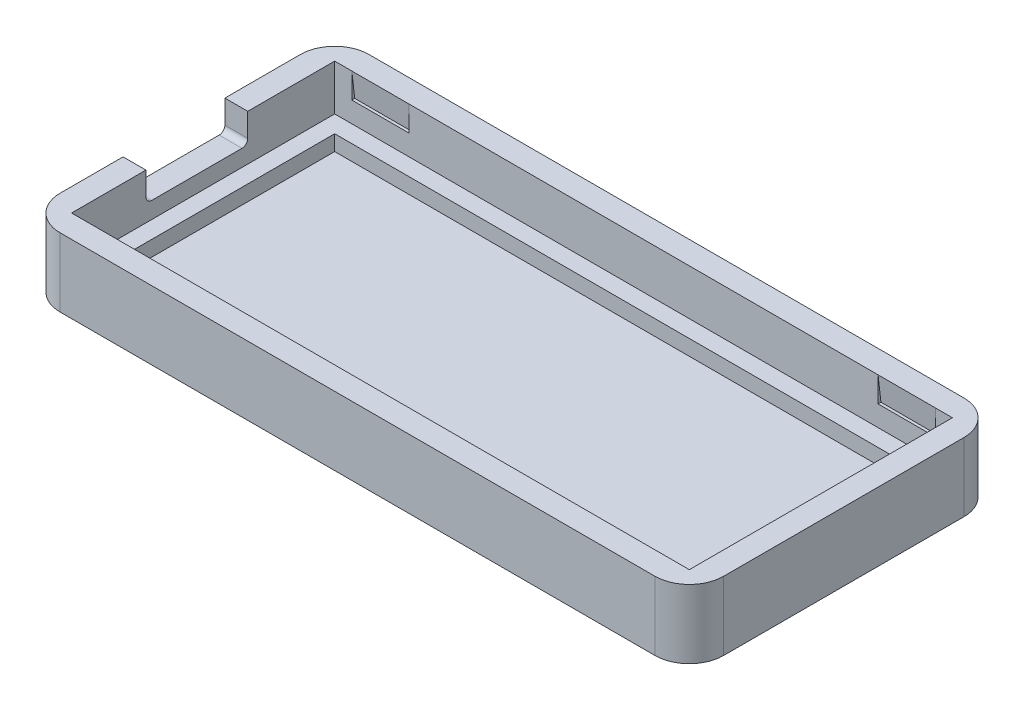
ISO-10303-21;
HEADER;
FILE_DESCRIPTION(('STEP AP214'),'2;1');
FILE_NAME('part.step','',(''),(''),'','','');
FILE_SCHEMA(('AUTOMOTIVE_DESIGN { 1 0 10303 214 1 1 1 1 }'));
ENDSEC;
DATA;
#1=APPLICATION_CONTEXT('core data for automotive mechanical design processes');
#2=APPLICATION_PROTOCOL_DEFINITION('international standard','automotive_design',2000,#1);
#3=PRODUCT_CONTEXT('',#1,'mechanical');
#4=PRODUCT('Part','Part','',(#3));
#5=PRODUCT_RELATED_PRODUCT_CATEGORY('part','',(#4));
#6=PRODUCT_DEFINITION_FORMATION('','',#4);
#7=PRODUCT_DEFINITION_CONTEXT('part definition',#1,'design');
#8=PRODUCT_DEFINITION('design','',#6,#7);
#9=PRODUCT_DEFINITION_SHAPE('','',#8);
#10=(LENGTH_UNIT() NAMED_UNIT(*) SI_UNIT(.MILLI.,.METRE.));
#11=(NAMED_UNIT(*) PLANE_ANGLE_UNIT() SI_UNIT($,.RADIAN.));
#12=(NAMED_UNIT(*) SI_UNIT($,.STERADIAN.) SOLID_ANGLE_UNIT());
#13=UNCERTAINTY_MEASURE_WITH_UNIT(LENGTH_MEASURE(1.E-05),#10,'distance_accuracy_value','');
#14=(GEOMETRIC_REPRESENTATION_CONTEXT(3) GLOBAL_UNCERTAINTY_ASSIGNED_CONTEXT((#13)) GLOBAL_UNIT_ASSIGNED_CONTEXT((#10,
#11,#12)) REPRESENTATION_CONTEXT('',''));
#15=CARTESIAN_POINT('',(0.,0.,0.));
#16=DIRECTION('',(0.,0.,1.));
#17=DIRECTION('',(1.,0.,0.));
#18=AXIS2_PLACEMENT_3D('',#15,#16,#17);
#19=CARTESIAN_POINT('',(-29.,6.,-13.5));
#20=DIRECTION('',(1.,0.,0.));
#21=DIRECTION('',(0.,0.,-1.));
#22=AXIS2_PLACEMENT_3D('',#19,#20,#21);
#23=PLANE('',#22);
#24=DIRECTION('',(0.,0.,1.));
#25=VECTOR('',#24,1.);
#26=CARTESIAN_POINT('',(-29.,0.,-13.5));
#27=LINE('',#26,#25);
#28=CARTESIAN_POINT('',(-29.,0.,-10.5));
#29=VERTEX_POINT('',#28);
#30=CARTESIAN_POINT('',(-29.,0.,10.5));
#31=VERTEX_POINT('',#30);
#32=EDGE_CURVE('E313',#29,#31,#27,.T.);
#33=ORIENTED_EDGE('',*,*,#32,.T.);
#34=DIRECTION('',(0.,-1.,0.));
#35=VECTOR('',#34,1.);
#36=CARTESIAN_POINT('',(-29.,6.,10.5));
#37=LINE('',#36,#35);
#38=CARTESIAN_POINT('',(-29.,6.,10.5));
#39=VERTEX_POINT('',#38);
#40=EDGE_CURVE('E12',#31,#39,#37,.F.);
#41=ORIENTED_EDGE('',*,*,#40,.T.);
#42=DIRECTION('',(0.,0.,1.));
#43=VECTOR('',#42,1.);
#44=CARTESIAN_POINT('',(-29.,6.,-13.5));
#45=LINE('',#44,#43);
#46=CARTESIAN_POINT('',(-29.,6.,5.));
#47=VERTEX_POINT('',#46);
#48=EDGE_CURVE('E318',#47,#39,#45,.T.);
#49=ORIENTED_EDGE('',*,*,#48,.F.);
#50=DIRECTION('',(0.,-1.,0.));
#51=VECTOR('',#50,1.);
#52=CARTESIAN_POINT('',(-29.,6.,5.));
#53=LINE('',#52,#51);
#54=CARTESIAN_POINT('',(-29.,3.95,5.));
#55=VERTEX_POINT('',#54);
#56=EDGE_CURVE('E814',#47,#55,#53,.T.);
#57=ORIENTED_EDGE('',*,*,#56,.T.);
#58=CARTESIAN_POINT('',(-29.,3.95,4.5));
#59=DIRECTION('',(1.,0.,0.));
#60=DIRECTION('',(0.,0.,-1.));
#61=AXIS2_PLACEMENT_3D('',#58,#59,#60);
#62=CIRCLE('',#61,0.5);
#63=CARTESIAN_POINT('',(-29.,3.45,4.5));
#64=VERTEX_POINT('',#63);
#65=EDGE_CURVE('E349',#55,#64,#62,.T.);
#66=ORIENTED_EDGE('',*,*,#65,.T.);
#67=DIRECTION('',(0.,0.,-1.));
#68=VECTOR('',#67,1.);
#69=CARTESIAN_POINT('',(-29.,3.45,5.));
#70=LINE('',#69,#68);
#71=CARTESIAN_POINT('',(-29.,3.45,-3.4));
#72=VERTEX_POINT('',#71);
#73=EDGE_CURVE('E950',#64,#72,#70,.T.);
#74=ORIENTED_EDGE('',*,*,#73,.T.);
#75=CARTESIAN_POINT('',(-29.,3.95,-3.4));
#76=DIRECTION('',(1.,0.,0.));
#77=DIRECTION('',(0.,0.,-1.));
#78=AXIS2_PLACEMENT_3D('',#75,#76,#77);
#79=CIRCLE('',#78,0.5);
#80=CARTESIAN_POINT('',(-29.,3.95,-3.9));
#81=VERTEX_POINT('',#80);
#82=EDGE_CURVE('E353',#72,#81,#79,.T.);
#83=ORIENTED_EDGE('',*,*,#82,.T.);
#84=DIRECTION('',(0.,1.,0.));
#85=VECTOR('',#84,1.);
#86=CARTESIAN_POINT('',(-29.,6.,-3.9));
#87=LINE('',#86,#85);
#88=CARTESIAN_POINT('',(-29.,6.,-3.9));
#89=VERTEX_POINT('',#88);
#90=EDGE_CURVE('E826',#81,#89,#87,.T.);
#91=ORIENTED_EDGE('',*,*,#90,.T.);
#92=CARTESIAN_POINT('',(-29.,6.,-10.5));
#93=VERTEX_POINT('',#92);
#94=EDGE_CURVE('E315',#93,#89,#45,.T.);
#95=ORIENTED_EDGE('',*,*,#94,.F.);
#96=DIRECTION('',(0.,-1.,0.));
#97=VECTOR('',#96,1.);
#98=CARTESIAN_POINT('',(-29.,6.,-10.5));
#99=LINE('',#98,#97);
#100=EDGE_CURVE('E43',#93,#29,#99,.T.);
#101=ORIENTED_EDGE('',*,*,#100,.T.);
#102=EDGE_LOOP('',(#33,#41,#49,#57,#66,#74,#83,#91,#95,#101));
#103=FACE_BOUND('',#102,.T.);
#104=ADVANCED_FACE('F35',(#103),#23,.F.);
#105=CARTESIAN_POINT('',(-29.,6.,13.5));
#106=DIRECTION('',(0.,0.,-1.));
#107=DIRECTION('',(-1.,0.,0.));
#108=AXIS2_PLACEMENT_3D('',#105,#106,#107);
#109=PLANE('',#108);
#110=DIRECTION('',(1.,0.,0.));
#111=VECTOR('',#110,1.);
#112=CARTESIAN_POINT('',(-29.,0.,13.5));
#113=LINE('',#112,#111);
#114=CARTESIAN_POINT('',(-26.,0.,13.5));
#115=VERTEX_POINT('',#114);
#116=CARTESIAN_POINT('',(26.,0.,13.5));
#117=VERTEX_POINT('',#116);
#118=EDGE_CURVE('E329',#115,#117,#113,.T.);
#119=ORIENTED_EDGE('',*,*,#118,.T.);
#120=DIRECTION('',(0.,-1.,0.));
#121=VECTOR('',#120,1.);
#122=CARTESIAN_POINT('',(26.,6.,13.5));
#123=LINE('',#122,#121);
#124=CARTESIAN_POINT('',(26.,6.,13.5));
#125=VERTEX_POINT('',#124);
#126=EDGE_CURVE('E384',#117,#125,#123,.F.);
#127=ORIENTED_EDGE('',*,*,#126,.T.);
#128=DIRECTION('',(1.,0.,0.));
#129=VECTOR('',#128,1.);
#130=CARTESIAN_POINT('',(-29.,6.,13.5));
#131=LINE('',#130,#129);
#132=CARTESIAN_POINT('',(-26.,6.,13.5));
#133=VERTEX_POINT('',#132);
#134=EDGE_CURVE('E317',#133,#125,#131,.T.);
#135=ORIENTED_EDGE('',*,*,#134,.F.);
#136=DIRECTION('',(0.,-1.,0.));
#137=VECTOR('',#136,1.);
#138=CARTESIAN_POINT('',(-26.,6.,13.5));
#139=LINE('',#138,#137);
#140=EDGE_CURVE('E381',#133,#115,#139,.T.);
#141=ORIENTED_EDGE('',*,*,#140,.T.);
#142=EDGE_LOOP('',(#119,#127,#135,#141));
#143=FACE_BOUND('',#142,.T.);
#144=ADVANCED_FACE('F404',(#143),#109,.F.);
#145=CARTESIAN_POINT('',(29.,6.,-13.5));
#146=DIRECTION('',(-1.,0.,0.));
#147=DIRECTION('',(0.,0.,1.));
#148=AXIS2_PLACEMENT_3D('',#145,#146,#147);
#149=PLANE('',#148);
#150=DIRECTION('',(0.,0.,-1.));
#151=VECTOR('',#150,1.);
#152=CARTESIAN_POINT('',(29.,0.,-13.5));
#153=LINE('',#152,#151);
#154=CARTESIAN_POINT('',(29.,0.,10.5));
#155=VERTEX_POINT('',#154);
#156=CARTESIAN_POINT('',(29.,0.,-10.5));
#157=VERTEX_POINT('',#156);
#158=EDGE_CURVE('E332',#155,#157,#153,.T.);
#159=ORIENTED_EDGE('',*,*,#158,.T.);
#160=DIRECTION('',(0.,-1.,0.));
#161=VECTOR('',#160,1.);
#162=CARTESIAN_POINT('',(29.,6.,-10.5));
#163=LINE('',#162,#161);
#164=CARTESIAN_POINT('',(29.,6.,-10.5));
#165=VERTEX_POINT('',#164);
#166=EDGE_CURVE('E371',#157,#165,#163,.F.);
#167=ORIENTED_EDGE('',*,*,#166,.T.);
#168=DIRECTION('',(0.,0.,-1.));
#169=VECTOR('',#168,1.);
#170=CARTESIAN_POINT('',(29.,6.,-13.5));
#171=LINE('',#170,#169);
#172=CARTESIAN_POINT('',(29.,6.,10.5));
#173=VERTEX_POINT('',#172);
#174=EDGE_CURVE('E321',#173,#165,#171,.T.);
#175=ORIENTED_EDGE('',*,*,#174,.F.);
#176=DIRECTION('',(0.,-1.,0.));
#177=VECTOR('',#176,1.);
#178=CARTESIAN_POINT('',(29.,6.,10.5));
#179=LINE('',#178,#177);
#180=EDGE_CURVE('E368',#173,#155,#179,.T.);
#181=ORIENTED_EDGE('',*,*,#180,.T.);
#182=EDGE_LOOP('',(#159,#167,#175,#181));
#183=FACE_BOUND('',#182,.T.);
#184=ADVANCED_FACE('F414',(#183),#149,.F.);
#185=CARTESIAN_POINT('',(-29.,6.,-13.5));
#186=DIRECTION('',(0.,0.,1.));
#187=DIRECTION('',(1.,0.,0.));
#188=AXIS2_PLACEMENT_3D('',#185,#186,#187);
#189=PLANE('',#188);
#190=DIRECTION('',(-1.,0.,0.));
#191=VECTOR('',#190,1.);
#192=CARTESIAN_POINT('',(-29.,6.,-13.5));
#193=LINE('',#192,#191);
#194=CARTESIAN_POINT('',(26.,6.,-13.5));
#195=VERTEX_POINT('',#194);
#196=CARTESIAN_POINT('',(-26.,6.,-13.5));
#197=VERTEX_POINT('',#196);
#198=EDGE_CURVE('E323',#195,#197,#193,.T.);
#199=ORIENTED_EDGE('',*,*,#198,.F.);
#200=DIRECTION('',(0.,-1.,0.));
#201=VECTOR('',#200,1.);
#202=CARTESIAN_POINT('',(26.,6.,-13.5));
#203=LINE('',#202,#201);
#204=CARTESIAN_POINT('',(26.,0.,-13.5));
#205=VERTEX_POINT('',#204);
#206=EDGE_CURVE('E357',#195,#205,#203,.T.);
#207=ORIENTED_EDGE('',*,*,#206,.T.);
#208=DIRECTION('',(-1.,0.,0.));
#209=VECTOR('',#208,1.);
#210=CARTESIAN_POINT('',(-29.,0.,-13.5));
#211=LINE('',#210,#209);
#212=CARTESIAN_POINT('',(-26.,0.,-13.5));
#213=VERTEX_POINT('',#212);
#214=EDGE_CURVE('E335',#205,#213,#211,.T.);
#215=ORIENTED_EDGE('',*,*,#214,.T.);
#216=DIRECTION('',(0.,-1.,0.));
#217=VECTOR('',#216,1.);
#218=CARTESIAN_POINT('',(-26.,6.,-13.5));
#219=LINE('',#218,#217);
#220=EDGE_CURVE('E355',#213,#197,#219,.F.);
#221=ORIENTED_EDGE('',*,*,#220,.T.);
#222=EDGE_LOOP('',(#199,#207,#215,#221));
#223=FACE_BOUND('',#222,.T.);
#224=ADVANCED_FACE('F422',(#223),#189,.F.);
#225=CARTESIAN_POINT('',(0.,6.,0.));
#226=DIRECTION('',(0.,1.,0.));
#227=DIRECTION('',(0.,0.,1.));
#228=AXIS2_PLACEMENT_3D('',#225,#226,#227);
#229=PLANE('',#228);
#230=ORIENTED_EDGE('',*,*,#174,.T.);
#231=CARTESIAN_POINT('',(26.,6.,-10.5));
#232=DIRECTION('',(0.,1.,0.));
#233=DIRECTION('',(0.,0.,1.));
#234=AXIS2_PLACEMENT_3D('',#231,#232,#233);
#235=CIRCLE('',#234,3.);
#236=EDGE_CURVE('E379',#165,#195,#235,.T.);
#237=ORIENTED_EDGE('',*,*,#236,.T.);
#238=ORIENTED_EDGE('',*,*,#198,.T.);
#239=CARTESIAN_POINT('',(-26.,6.,-10.5));
#240=DIRECTION('',(0.,1.,0.));
#241=DIRECTION('',(0.,0.,1.));
#242=AXIS2_PLACEMENT_3D('',#239,#240,#241);
#243=CIRCLE('',#242,3.);
#244=EDGE_CURVE('E373',#197,#93,#243,.T.);
#245=ORIENTED_EDGE('',*,*,#244,.T.);
#246=ORIENTED_EDGE('',*,*,#94,.T.);
#247=DIRECTION('',(1.,0.,0.));
#248=VECTOR('',#247,1.);
#249=CARTESIAN_POINT('',(-29.,6.,-3.9));
#250=LINE('',#249,#248);
#251=CARTESIAN_POINT('',(-27.,6.,-3.9));
#252=VERTEX_POINT('',#251);
#253=EDGE_CURVE('E823',#89,#252,#250,.T.);
#254=ORIENTED_EDGE('',*,*,#253,.T.);
#255=DIRECTION('',(0.,0.,1.));
#256=VECTOR('',#255,1.);
#257=CARTESIAN_POINT('',(-27.,6.,-11.5));
#258=LINE('',#257,#256);
#259=CARTESIAN_POINT('',(-27.,6.,-11.5));
#260=VERTEX_POINT('',#259);
#261=EDGE_CURVE('E831',#260,#252,#258,.T.);
#262=ORIENTED_EDGE('',*,*,#261,.F.);
#263=DIRECTION('',(-1.,0.,0.));
#264=VECTOR('',#263,1.);
#265=CARTESIAN_POINT('',(-27.,6.,-11.5));
#266=LINE('',#265,#264);
#267=CARTESIAN_POINT('',(-25.5,6.,-11.5));
#268=VERTEX_POINT('',#267);
#269=EDGE_CURVE('E283',#268,#260,#266,.T.);
#270=ORIENTED_EDGE('',*,*,#269,.F.);
#271=DIRECTION('',(-1.,0.,0.));
#272=VECTOR('',#271,1.);
#273=CARTESIAN_POINT('',(-20.5,6.,-11.5));
#274=LINE('',#273,#272);
#275=CARTESIAN_POINT('',(-20.5,6.,-11.5));
#276=VERTEX_POINT('',#275);
#277=EDGE_CURVE('E259',#276,#268,#274,.T.);
#278=ORIENTED_EDGE('',*,*,#277,.F.);
#279=CARTESIAN_POINT('',(20.5,6.,-11.5));
#280=VERTEX_POINT('',#279);
#281=EDGE_CURVE('E281',#280,#276,#266,.T.);
#282=ORIENTED_EDGE('',*,*,#281,.F.);
#283=DIRECTION('',(1.,0.,0.));
#284=VECTOR('',#283,1.);
#285=CARTESIAN_POINT('',(20.5,6.,-11.5));
#286=LINE('',#285,#284);
#287=CARTESIAN_POINT('',(25.5,6.,-11.5));
#288=VERTEX_POINT('',#287);
#289=EDGE_CURVE('E853',#280,#288,#286,.T.);
#290=ORIENTED_EDGE('',*,*,#289,.T.);
#291=CARTESIAN_POINT('',(27.,6.,-11.5));
#292=VERTEX_POINT('',#291);
#293=EDGE_CURVE('E292',#292,#288,#266,.T.);
#294=ORIENTED_EDGE('',*,*,#293,.F.);
#295=DIRECTION('',(0.,0.,-1.));
#296=VECTOR('',#295,1.);
#297=CARTESIAN_POINT('',(27.,6.,-11.5));
#298=LINE('',#297,#296);
#299=CARTESIAN_POINT('',(27.,6.,11.5));
#300=VERTEX_POINT('',#299);
#301=EDGE_CURVE('E296',#300,#292,#298,.T.);
#302=ORIENTED_EDGE('',*,*,#301,.F.);
#303=DIRECTION('',(1.,0.,0.));
#304=VECTOR('',#303,1.);
#305=CARTESIAN_POINT('',(-27.,6.,11.5));
#306=LINE('',#305,#304);
#307=CARTESIAN_POINT('',(25.5,6.,11.5));
#308=VERTEX_POINT('',#307);
#309=EDGE_CURVE('E833',#308,#300,#306,.T.);
#310=ORIENTED_EDGE('',*,*,#309,.F.);
#311=DIRECTION('',(1.,0.,0.));
#312=VECTOR('',#311,1.);
#313=CARTESIAN_POINT('',(20.5,6.,11.5));
#314=LINE('',#313,#312);
#315=CARTESIAN_POINT('',(20.5,6.,11.5));
#316=VERTEX_POINT('',#315);
#317=EDGE_CURVE('E914',#316,#308,#314,.T.);
#318=ORIENTED_EDGE('',*,*,#317,.F.);
#319=CARTESIAN_POINT('',(-20.5,6.,11.5));
#320=VERTEX_POINT('',#319);
#321=EDGE_CURVE('E836',#320,#316,#306,.T.);
#322=ORIENTED_EDGE('',*,*,#321,.F.);
#323=DIRECTION('',(-1.,0.,0.));
#324=VECTOR('',#323,1.);
#325=CARTESIAN_POINT('',(-20.5,6.,11.5));
#326=LINE('',#325,#324);
#327=CARTESIAN_POINT('',(-25.5,6.,11.5));
#328=VERTEX_POINT('',#327);
#329=EDGE_CURVE('E865',#320,#328,#326,.T.);
#330=ORIENTED_EDGE('',*,*,#329,.T.);
#331=CARTESIAN_POINT('',(-27.,6.,11.5));
#332=VERTEX_POINT('',#331);
#333=EDGE_CURVE('E834',#332,#328,#306,.T.);
#334=ORIENTED_EDGE('',*,*,#333,.F.);
#335=CARTESIAN_POINT('',(-27.,6.,5.));
#336=VERTEX_POINT('',#335);
#337=EDGE_CURVE('E822',#336,#332,#258,.T.);
#338=ORIENTED_EDGE('',*,*,#337,.F.);
#339=DIRECTION('',(1.,0.,0.));
#340=VECTOR('',#339,1.);
#341=CARTESIAN_POINT('',(-29.,6.,5.));
#342=LINE('',#341,#340);
#343=EDGE_CURVE('E820',#47,#336,#342,.T.);
#344=ORIENTED_EDGE('',*,*,#343,.F.);
#345=ORIENTED_EDGE('',*,*,#48,.T.);
#346=CARTESIAN_POINT('',(-26.,6.,10.5));
#347=DIRECTION('',(0.,1.,0.));
#348=DIRECTION('',(0.,0.,1.));
#349=AXIS2_PLACEMENT_3D('',#346,#347,#348);
#350=CIRCLE('',#349,3.);
#351=EDGE_CURVE('E375',#39,#133,#350,.T.);
#352=ORIENTED_EDGE('',*,*,#351,.T.);
#353=ORIENTED_EDGE('',*,*,#134,.T.);
#354=CARTESIAN_POINT('',(26.,6.,10.5));
#355=DIRECTION('',(0.,1.,0.));
#356=DIRECTION('',(0.,0.,1.));
#357=AXIS2_PLACEMENT_3D('',#354,#355,#356);
#358=CIRCLE('',#357,3.);
#359=EDGE_CURVE('E377',#125,#173,#358,.T.);
#360=ORIENTED_EDGE('',*,*,#359,.T.);
#361=EDGE_LOOP('',(#230,#237,#238,#245,#246,#254,#262,#270,#278,#282,#290,#294,#302,#310,#318,
#322,#330,#334,#338,#344,#345,#352,#353,#360));
#362=FACE_BOUND('',#361,.T.);
#363=ADVANCED_FACE('F279',(#362),#229,.T.);
#364=CARTESIAN_POINT('',(0.,0.,0.));
#365=DIRECTION('',(0.,1.,0.));
#366=DIRECTION('',(0.,0.,1.));
#367=AXIS2_PLACEMENT_3D('',#364,#365,#366);
#368=PLANE('',#367);
#369=ORIENTED_EDGE('',*,*,#214,.F.);
#370=CARTESIAN_POINT('',(26.,0.,-10.5));
#371=DIRECTION('',(0.,1.,0.));
#372=DIRECTION('',(0.,0.,1.));
#373=AXIS2_PLACEMENT_3D('',#370,#371,#372);
#374=CIRCLE('',#373,3.);
#375=EDGE_CURVE('E366',#205,#157,#374,.F.);
#376=ORIENTED_EDGE('',*,*,#375,.T.);
#377=ORIENTED_EDGE('',*,*,#158,.F.);
#378=CARTESIAN_POINT('',(26.,0.,10.5));
#379=DIRECTION('',(0.,1.,0.));
#380=DIRECTION('',(0.,0.,1.));
#381=AXIS2_PLACEMENT_3D('',#378,#379,#380);
#382=CIRCLE('',#381,3.);
#383=EDGE_CURVE('E364',#155,#117,#382,.F.);
#384=ORIENTED_EDGE('',*,*,#383,.T.);
#385=ORIENTED_EDGE('',*,*,#118,.F.);
#386=CARTESIAN_POINT('',(-26.,0.,10.5));
#387=DIRECTION('',(0.,1.,0.));
#388=DIRECTION('',(0.,0.,1.));
#389=AXIS2_PLACEMENT_3D('',#386,#387,#388);
#390=CIRCLE('',#389,3.);
#391=EDGE_CURVE('E362',#115,#31,#390,.F.);
#392=ORIENTED_EDGE('',*,*,#391,.T.);
#393=ORIENTED_EDGE('',*,*,#32,.F.);
#394=CARTESIAN_POINT('',(-26.,0.,-10.5));
#395=DIRECTION('',(0.,1.,0.));
#396=DIRECTION('',(0.,0.,1.));
#397=AXIS2_PLACEMENT_3D('',#394,#395,#396);
#398=CIRCLE('',#397,3.);
#399=EDGE_CURVE('E360',#29,#213,#398,.F.);
#400=ORIENTED_EDGE('',*,*,#399,.T.);
#401=EDGE_LOOP('',(#369,#376,#377,#384,#385,#392,#393,#400));
#402=FACE_BOUND('',#401,.T.);
#403=ADVANCED_FACE('F396',(#402),#368,.F.);
#404=CARTESIAN_POINT('',(-27.,-58.6941223633168,-11.5));
#405=DIRECTION('',(-1.,0.,0.));
#406=DIRECTION('',(0.,0.,1.));
#407=AXIS2_PLACEMENT_3D('',#404,#405,#406);
#408=PLANE('',#407);
#409=DIRECTION('',(0.,0.,-1.));
#410=VECTOR('',#409,1.);
#411=CARTESIAN_POINT('',(-27.,3.45,5.));
#412=LINE('',#411,#410);
#413=CARTESIAN_POINT('',(-27.,3.45,4.5));
#414=VERTEX_POINT('',#413);
#415=CARTESIAN_POINT('',(-27.,3.45,-3.4));
#416=VERTEX_POINT('',#415);
#417=EDGE_CURVE('E806',#414,#416,#412,.T.);
#418=ORIENTED_EDGE('',*,*,#417,.F.);
#419=CARTESIAN_POINT('',(-27.,3.95,4.5));
#420=DIRECTION('',(-1.,0.,0.));
#421=DIRECTION('',(0.,0.,1.));
#422=AXIS2_PLACEMENT_3D('',#419,#420,#421);
#423=CIRCLE('',#422,0.5);
#424=CARTESIAN_POINT('',(-27.,3.95,5.));
#425=VERTEX_POINT('',#424);
#426=EDGE_CURVE('E347',#414,#425,#423,.T.);
#427=ORIENTED_EDGE('',*,*,#426,.T.);
#428=DIRECTION('',(0.,-1.,0.));
#429=VECTOR('',#428,1.);
#430=CARTESIAN_POINT('',(-27.,6.,5.));
#431=LINE('',#430,#429);
#432=EDGE_CURVE('E812',#336,#425,#431,.T.);
#433=ORIENTED_EDGE('',*,*,#432,.F.);
#434=ORIENTED_EDGE('',*,*,#337,.T.);
#435=DIRECTION('',(0.,1.,0.));
#436=VECTOR('',#435,1.);
#437=CARTESIAN_POINT('',(-27.,-58.6941223633168,11.5));
#438=LINE('',#437,#436);
#439=CARTESIAN_POINT('',(-27.,2.,11.5));
#440=VERTEX_POINT('',#439);
#441=EDGE_CURVE('E295',#440,#332,#438,.T.);
#442=ORIENTED_EDGE('',*,*,#441,.F.);
#443=DIRECTION('',(0.,0.,-1.));
#444=VECTOR('',#443,1.);
#445=CARTESIAN_POINT('',(-27.,2.,-11.5));
#446=LINE('',#445,#444);
#447=CARTESIAN_POINT('',(-27.,2.,-11.5));
#448=VERTEX_POINT('',#447);
#449=EDGE_CURVE('E314',#440,#448,#446,.T.);
#450=ORIENTED_EDGE('',*,*,#449,.T.);
#451=DIRECTION('',(0.,1.,0.));
#452=VECTOR('',#451,1.);
#453=CARTESIAN_POINT('',(-27.,-58.6941223633168,-11.5));
#454=LINE('',#453,#452);
#455=EDGE_CURVE('E300',#448,#260,#454,.T.);
#456=ORIENTED_EDGE('',*,*,#455,.T.);
#457=ORIENTED_EDGE('',*,*,#261,.T.);
#458=DIRECTION('',(0.,1.,0.));
#459=VECTOR('',#458,1.);
#460=CARTESIAN_POINT('',(-27.,6.,-3.9));
#461=LINE('',#460,#459);
#462=CARTESIAN_POINT('',(-27.,3.95,-3.9));
#463=VERTEX_POINT('',#462);
#464=EDGE_CURVE('E811',#463,#252,#461,.T.);
#465=ORIENTED_EDGE('',*,*,#464,.F.);
#466=CARTESIAN_POINT('',(-27.,3.95,-3.4));
#467=DIRECTION('',(-1.,0.,0.));
#468=DIRECTION('',(0.,0.,1.));
#469=AXIS2_PLACEMENT_3D('',#466,#467,#468);
#470=CIRCLE('',#469,0.5);
#471=EDGE_CURVE('E351',#463,#416,#470,.T.);
#472=ORIENTED_EDGE('',*,*,#471,.T.);
#473=EDGE_LOOP('',(#418,#427,#433,#434,#442,#450,#456,#457,#465,#472));
#474=FACE_BOUND('',#473,.T.);
#475=ADVANCED_FACE('F631',(#474),#408,.F.);
#476=CARTESIAN_POINT('',(-27.,-58.6941223633168,-11.5));
#477=DIRECTION('',(0.,0.,-1.));
#478=DIRECTION('',(-1.,0.,0.));
#479=AXIS2_PLACEMENT_3D('',#476,#477,#478);
#480=PLANE('',#479);
#481=ORIENTED_EDGE('',*,*,#281,.T.);
#482=DIRECTION('',(0.,1.,0.));
#483=VECTOR('',#482,1.);
#484=CARTESIAN_POINT('',(-20.5,0.,-11.5));
#485=LINE('',#484,#483);
#486=CARTESIAN_POINT('',(-20.5,3.8,-11.5));
#487=VERTEX_POINT('',#486);
#488=EDGE_CURVE('E265',#487,#276,#485,.T.);
#489=ORIENTED_EDGE('',*,*,#488,.F.);
#490=DIRECTION('',(-1.,0.,0.));
#491=VECTOR('',#490,1.);
#492=CARTESIAN_POINT('',(-20.5,3.8,-11.5));
#493=LINE('',#492,#491);
#494=CARTESIAN_POINT('',(-25.5,3.8,-11.5));
#495=VERTEX_POINT('',#494);
#496=EDGE_CURVE('E285',#487,#495,#493,.T.);
#497=ORIENTED_EDGE('',*,*,#496,.T.);
#498=DIRECTION('',(0.,1.,0.));
#499=VECTOR('',#498,1.);
#500=CARTESIAN_POINT('',(-25.5,0.,-11.5));
#501=LINE('',#500,#499);
#502=EDGE_CURVE('E991',#495,#268,#501,.T.);
#503=ORIENTED_EDGE('',*,*,#502,.T.);
#504=ORIENTED_EDGE('',*,*,#269,.T.);
#505=ORIENTED_EDGE('',*,*,#455,.F.);
#506=DIRECTION('',(1.,0.,0.));
#507=VECTOR('',#506,1.);
#508=CARTESIAN_POINT('',(-27.,2.,-11.5));
#509=LINE('',#508,#507);
#510=CARTESIAN_POINT('',(27.,2.,-11.5));
#511=VERTEX_POINT('',#510);
#512=EDGE_CURVE('E828',#448,#511,#509,.T.);
#513=ORIENTED_EDGE('',*,*,#512,.T.);
#514=DIRECTION('',(0.,1.,0.));
#515=VECTOR('',#514,1.);
#516=CARTESIAN_POINT('',(27.,-58.6941223633168,-11.5));
#517=LINE('',#516,#515);
#518=EDGE_CURVE('E304',#511,#292,#517,.T.);
#519=ORIENTED_EDGE('',*,*,#518,.T.);
#520=ORIENTED_EDGE('',*,*,#293,.T.);
#521=DIRECTION('',(0.,1.,0.));
#522=VECTOR('',#521,1.);
#523=CARTESIAN_POINT('',(25.5,0.,-11.5));
#524=LINE('',#523,#522);
#525=CARTESIAN_POINT('',(25.5,3.8,-11.5));
#526=VERTEX_POINT('',#525);
#527=EDGE_CURVE('E855',#526,#288,#524,.T.);
#528=ORIENTED_EDGE('',*,*,#527,.F.);
#529=DIRECTION('',(1.,0.,0.));
#530=VECTOR('',#529,1.);
#531=CARTESIAN_POINT('',(20.5,3.8,-11.5));
#532=LINE('',#531,#530);
#533=CARTESIAN_POINT('',(20.5,3.8,-11.5));
#534=VERTEX_POINT('',#533);
#535=EDGE_CURVE('E892',#534,#526,#532,.T.);
#536=ORIENTED_EDGE('',*,*,#535,.F.);
#537=DIRECTION('',(0.,1.,0.));
#538=VECTOR('',#537,1.);
#539=CARTESIAN_POINT('',(20.5,0.,-11.5));
#540=LINE('',#539,#538);
#541=EDGE_CURVE('E291',#534,#280,#540,.T.);
#542=ORIENTED_EDGE('',*,*,#541,.T.);
#543=EDGE_LOOP('',(#481,#489,#497,#503,#504,#505,#513,#519,#520,#528,#536,#542));
#544=FACE_BOUND('',#543,.T.);
#545=ADVANCED_FACE('F288',(#544),#480,.F.);
#546=CARTESIAN_POINT('',(27.,-58.6941223633168,-11.5));
#547=DIRECTION('',(1.,0.,0.));
#548=DIRECTION('',(0.,0.,-1.));
#549=AXIS2_PLACEMENT_3D('',#546,#547,#548);
#550=PLANE('',#549);
#551=DIRECTION('',(0.,0.,1.));
#552=VECTOR('',#551,1.);
#553=CARTESIAN_POINT('',(27.,2.,-11.5));
#554=LINE('',#553,#552);
#555=CARTESIAN_POINT('',(27.,2.,11.5));
#556=VERTEX_POINT('',#555);
#557=EDGE_CURVE('E303',#511,#556,#554,.T.);
#558=ORIENTED_EDGE('',*,*,#557,.T.);
#559=DIRECTION('',(0.,1.,0.));
#560=VECTOR('',#559,1.);
#561=CARTESIAN_POINT('',(27.,-58.6941223633168,11.5));
#562=LINE('',#561,#560);
#563=EDGE_CURVE('E306',#556,#300,#562,.T.);
#564=ORIENTED_EDGE('',*,*,#563,.T.);
#565=ORIENTED_EDGE('',*,*,#301,.T.);
#566=ORIENTED_EDGE('',*,*,#518,.F.);
#567=EDGE_LOOP('',(#558,#564,#565,#566));
#568=FACE_BOUND('',#567,.T.);
#569=ADVANCED_FACE('F630',(#568),#550,.F.);
#570=CARTESIAN_POINT('',(-27.,-58.6941223633168,11.5));
#571=DIRECTION('',(0.,0.,1.));
#572=DIRECTION('',(1.,0.,0.));
#573=AXIS2_PLACEMENT_3D('',#570,#571,#572);
#574=PLANE('',#573);
#575=DIRECTION('',(-1.,0.,0.));
#576=VECTOR('',#575,1.);
#577=CARTESIAN_POINT('',(-20.5,3.8,11.5));
#578=LINE('',#577,#576);
#579=CARTESIAN_POINT('',(-20.5,3.8,11.5));
#580=VERTEX_POINT('',#579);
#581=CARTESIAN_POINT('',(-25.5,3.8,11.5));
#582=VERTEX_POINT('',#581);
#583=EDGE_CURVE('E868',#580,#582,#578,.T.);
#584=ORIENTED_EDGE('',*,*,#583,.F.);
#585=DIRECTION('',(0.,1.,0.));
#586=VECTOR('',#585,1.);
#587=CARTESIAN_POINT('',(-20.5,0.,11.5));
#588=LINE('',#587,#586);
#589=EDGE_CURVE('E974',#580,#320,#588,.T.);
#590=ORIENTED_EDGE('',*,*,#589,.T.);
#591=ORIENTED_EDGE('',*,*,#321,.T.);
#592=DIRECTION('',(0.,1.,0.));
#593=VECTOR('',#592,1.);
#594=CARTESIAN_POINT('',(20.5,0.,11.5));
#595=LINE('',#594,#593);
#596=CARTESIAN_POINT('',(20.5,3.8,11.5));
#597=VERTEX_POINT('',#596);
#598=EDGE_CURVE('E904',#597,#316,#595,.T.);
#599=ORIENTED_EDGE('',*,*,#598,.F.);
#600=DIRECTION('',(1.,0.,0.));
#601=VECTOR('',#600,1.);
#602=CARTESIAN_POINT('',(20.5,3.8,11.5));
#603=LINE('',#602,#601);
#604=CARTESIAN_POINT('',(25.5,3.8,11.5));
#605=VERTEX_POINT('',#604);
#606=EDGE_CURVE('E907',#597,#605,#603,.T.);
#607=ORIENTED_EDGE('',*,*,#606,.T.);
#608=DIRECTION('',(0.,1.,0.));
#609=VECTOR('',#608,1.);
#610=CARTESIAN_POINT('',(25.5,0.,11.5));
#611=LINE('',#610,#609);
#612=EDGE_CURVE('E847',#605,#308,#611,.T.);
#613=ORIENTED_EDGE('',*,*,#612,.T.);
#614=ORIENTED_EDGE('',*,*,#309,.T.);
#615=ORIENTED_EDGE('',*,*,#563,.F.);
#616=DIRECTION('',(-1.,0.,0.));
#617=VECTOR('',#616,1.);
#618=CARTESIAN_POINT('',(-27.,2.,11.5));
#619=LINE('',#618,#617);
#620=EDGE_CURVE('E311',#556,#440,#619,.T.);
#621=ORIENTED_EDGE('',*,*,#620,.T.);
#622=ORIENTED_EDGE('',*,*,#441,.T.);
#623=ORIENTED_EDGE('',*,*,#333,.T.);
#624=DIRECTION('',(0.,1.,0.));
#625=VECTOR('',#624,1.);
#626=CARTESIAN_POINT('',(-25.5,0.,11.5));
#627=LINE('',#626,#625);
#628=EDGE_CURVE('E984',#582,#328,#627,.T.);
#629=ORIENTED_EDGE('',*,*,#628,.F.);
#630=EDGE_LOOP('',(#584,#590,#591,#599,#607,#613,#614,#615,#621,#622,#623,#629));
#631=FACE_BOUND('',#630,.T.);
#632=ADVANCED_FACE('F477',(#631),#574,.F.);
#633=CARTESIAN_POINT('',(0.,2.,0.));
#634=DIRECTION('',(0.,1.,0.));
#635=DIRECTION('',(0.,0.,1.));
#636=AXIS2_PLACEMENT_3D('',#633,#634,#635);
#637=PLANE('',#636);
#638=DIRECTION('',(-1.,0.,0.));
#639=VECTOR('',#638,1.);
#640=CARTESIAN_POINT('',(25.5,2.,-10.));
#641=LINE('',#640,#639);
#642=CARTESIAN_POINT('',(25.5,2.,-10.));
#643=VERTEX_POINT('',#642);
#644=CARTESIAN_POINT('',(-25.5,2.,-10.));
#645=VERTEX_POINT('',#644);
#646=EDGE_CURVE('E897',#643,#645,#641,.T.);
#647=ORIENTED_EDGE('',*,*,#646,.F.);
#648=DIRECTION('',(0.,0.,-1.));
#649=VECTOR('',#648,1.);
#650=CARTESIAN_POINT('',(25.5,2.,10.));
#651=LINE('',#650,#649);
#652=CARTESIAN_POINT('',(25.5,2.,10.));
#653=VERTEX_POINT('',#652);
#654=EDGE_CURVE('E922',#653,#643,#651,.T.);
#655=ORIENTED_EDGE('',*,*,#654,.F.);
#656=DIRECTION('',(1.,0.,0.));
#657=VECTOR('',#656,1.);
#658=CARTESIAN_POINT('',(-25.5,2.,10.));
#659=LINE('',#658,#657);
#660=CARTESIAN_POINT('',(-25.5,2.,10.));
#661=VERTEX_POINT('',#660);
#662=EDGE_CURVE('E937',#661,#653,#659,.T.);
#663=ORIENTED_EDGE('',*,*,#662,.F.);
#664=DIRECTION('',(0.,0.,1.));
#665=VECTOR('',#664,1.);
#666=CARTESIAN_POINT('',(-25.5,2.,-10.));
#667=LINE('',#666,#665);
#668=EDGE_CURVE('E934',#645,#661,#667,.T.);
#669=ORIENTED_EDGE('',*,*,#668,.F.);
#670=EDGE_LOOP('',(#647,#655,#663,#669));
#671=FACE_BOUND('',#670,.T.);
#672=ORIENTED_EDGE('',*,*,#449,.F.);
#673=ORIENTED_EDGE('',*,*,#620,.F.);
#674=ORIENTED_EDGE('',*,*,#557,.F.);
#675=ORIENTED_EDGE('',*,*,#512,.F.);
#676=EDGE_LOOP('',(#672,#673,#674,#675));
#677=FACE_BOUND('',#676,.T.);
#678=ADVANCED_FACE('F471',(#671,#677),#637,.T.);
#679=CARTESIAN_POINT('',(-29.,6.,5.));
#680=DIRECTION('',(0.,0.,1.));
#681=DIRECTION('',(0.,-1.,0.));
#682=AXIS2_PLACEMENT_3D('',#679,#680,#681);
#683=PLANE('',#682);
#684=ORIENTED_EDGE('',*,*,#432,.T.);
#685=DIRECTION('',(1.,0.,0.));
#686=VECTOR('',#685,1.);
#687=CARTESIAN_POINT('',(-29.,3.95,5.));
#688=LINE('',#687,#686);
#689=EDGE_CURVE('E342',#425,#55,#688,.F.);
#690=ORIENTED_EDGE('',*,*,#689,.T.);
#691=ORIENTED_EDGE('',*,*,#56,.F.);
#692=ORIENTED_EDGE('',*,*,#343,.T.);
#693=EDGE_LOOP('',(#684,#690,#691,#692));
#694=FACE_BOUND('',#693,.T.);
#695=ADVANCED_FACE('F476',(#694),#683,.F.);
#696=CARTESIAN_POINT('',(-29.,6.,-3.9));
#697=DIRECTION('',(0.,0.,-1.));
#698=DIRECTION('',(-1.,0.,0.));
#699=AXIS2_PLACEMENT_3D('',#696,#697,#698);
#700=PLANE('',#699);
#701=ORIENTED_EDGE('',*,*,#90,.F.);
#702=DIRECTION('',(1.,0.,0.));
#703=VECTOR('',#702,1.);
#704=CARTESIAN_POINT('',(-27.,3.95,-3.9));
#705=LINE('',#704,#703);
#706=EDGE_CURVE('E344',#81,#463,#705,.T.);
#707=ORIENTED_EDGE('',*,*,#706,.T.);
#708=ORIENTED_EDGE('',*,*,#464,.T.);
#709=ORIENTED_EDGE('',*,*,#253,.F.);
#710=EDGE_LOOP('',(#701,#707,#708,#709));
#711=FACE_BOUND('',#710,.T.);
#712=ADVANCED_FACE('F718',(#711),#700,.F.);
#713=CARTESIAN_POINT('',(-29.,3.45,5.));
#714=DIRECTION('',(0.,-1.,0.));
#715=DIRECTION('',(0.,0.,-1.));
#716=AXIS2_PLACEMENT_3D('',#713,#714,#715);
#717=PLANE('',#716);
#718=ORIENTED_EDGE('',*,*,#73,.F.);
#719=DIRECTION('',(1.,0.,0.));
#720=VECTOR('',#719,1.);
#721=CARTESIAN_POINT('',(-27.,3.45,4.5));
#722=LINE('',#721,#720);
#723=EDGE_CURVE('E339',#64,#414,#722,.T.);
#724=ORIENTED_EDGE('',*,*,#723,.T.);
#725=ORIENTED_EDGE('',*,*,#417,.T.);
#726=DIRECTION('',(1.,0.,0.));
#727=VECTOR('',#726,1.);
#728=CARTESIAN_POINT('',(-29.,3.45,-3.4));
#729=LINE('',#728,#727);
#730=EDGE_CURVE('E326',#416,#72,#729,.F.);
#731=ORIENTED_EDGE('',*,*,#730,.T.);
#732=EDGE_LOOP('',(#718,#724,#725,#731));
#733=FACE_BOUND('',#732,.T.);
#734=ADVANCED_FACE('F445',(#733),#717,.F.);
#735=CARTESIAN_POINT('',(-29.,3.95,4.5));
#736=DIRECTION('',(-1.,0.,0.));
#737=DIRECTION('',(0.,0.,1.));
#738=AXIS2_PLACEMENT_3D('',#735,#736,#737);
#739=CYLINDRICAL_SURFACE('',#738,0.5);
#740=ORIENTED_EDGE('',*,*,#65,.F.);
#741=ORIENTED_EDGE('',*,*,#689,.F.);
#742=ORIENTED_EDGE('',*,*,#426,.F.);
#743=ORIENTED_EDGE('',*,*,#723,.F.);
#744=EDGE_LOOP('',(#740,#741,#742,#743));
#745=FACE_BOUND('',#744,.T.);
#746=ADVANCED_FACE('F441',(#745),#739,.F.);
#747=CARTESIAN_POINT('',(-29.,3.95,-3.4));
#748=DIRECTION('',(-1.,0.,0.));
#749=DIRECTION('',(0.,0.,1.));
#750=AXIS2_PLACEMENT_3D('',#747,#748,#749);
#751=CYLINDRICAL_SURFACE('',#750,0.5);
#752=ORIENTED_EDGE('',*,*,#82,.F.);
#753=ORIENTED_EDGE('',*,*,#730,.F.);
#754=ORIENTED_EDGE('',*,*,#471,.F.);
#755=ORIENTED_EDGE('',*,*,#706,.F.);
#756=EDGE_LOOP('',(#752,#753,#754,#755));
#757=FACE_BOUND('',#756,.T.);
#758=ADVANCED_FACE('F444',(#757),#751,.F.);
#759=CARTESIAN_POINT('',(26.,6.,-10.5));
#760=DIRECTION('',(0.,-1.,0.));
#761=DIRECTION('',(0.,0.,-1.));
#762=AXIS2_PLACEMENT_3D('',#759,#760,#761);
#763=CYLINDRICAL_SURFACE('',#762,3.);
#764=ORIENTED_EDGE('',*,*,#236,.F.);
#765=ORIENTED_EDGE('',*,*,#166,.F.);
#766=ORIENTED_EDGE('',*,*,#375,.F.);
#767=ORIENTED_EDGE('',*,*,#206,.F.);
#768=EDGE_LOOP('',(#764,#765,#766,#767));
#769=FACE_BOUND('',#768,.T.);
#770=ADVANCED_FACE('F419',(#769),#763,.T.);
#771=CARTESIAN_POINT('',(26.,6.,10.5));
#772=DIRECTION('',(0.,-1.,0.));
#773=DIRECTION('',(0.,0.,-1.));
#774=AXIS2_PLACEMENT_3D('',#771,#772,#773);
#775=CYLINDRICAL_SURFACE('',#774,3.);
#776=ORIENTED_EDGE('',*,*,#359,.F.);
#777=ORIENTED_EDGE('',*,*,#126,.F.);
#778=ORIENTED_EDGE('',*,*,#383,.F.);
#779=ORIENTED_EDGE('',*,*,#180,.F.);
#780=EDGE_LOOP('',(#776,#777,#778,#779));
#781=FACE_BOUND('',#780,.T.);
#782=ADVANCED_FACE('F411',(#781),#775,.T.);
#783=CARTESIAN_POINT('',(-26.,6.,10.5));
#784=DIRECTION('',(0.,-1.,0.));
#785=DIRECTION('',(0.,0.,-1.));
#786=AXIS2_PLACEMENT_3D('',#783,#784,#785);
#787=CYLINDRICAL_SURFACE('',#786,3.);
#788=ORIENTED_EDGE('',*,*,#351,.F.);
#789=ORIENTED_EDGE('',*,*,#40,.F.);
#790=ORIENTED_EDGE('',*,*,#391,.F.);
#791=ORIENTED_EDGE('',*,*,#140,.F.);
#792=EDGE_LOOP('',(#788,#789,#790,#791));
#793=FACE_BOUND('',#792,.T.);
#794=ADVANCED_FACE('F401',(#793),#787,.T.);
#795=CARTESIAN_POINT('',(-26.,6.,-10.5));
#796=DIRECTION('',(0.,-1.,0.));
#797=DIRECTION('',(0.,0.,-1.));
#798=AXIS2_PLACEMENT_3D('',#795,#796,#797);
#799=CYLINDRICAL_SURFACE('',#798,3.);
#800=ORIENTED_EDGE('',*,*,#244,.F.);
#801=ORIENTED_EDGE('',*,*,#220,.F.);
#802=ORIENTED_EDGE('',*,*,#399,.F.);
#803=ORIENTED_EDGE('',*,*,#100,.F.);
#804=EDGE_LOOP('',(#800,#801,#802,#803));
#805=FACE_BOUND('',#804,.T.);
#806=ADVANCED_FACE('F37',(#805),#799,.T.);
#807=CARTESIAN_POINT('',(25.5,0.65,-10.));
#808=DIRECTION('',(0.,0.,-1.));
#809=DIRECTION('',(-1.,0.,0.));
#810=AXIS2_PLACEMENT_3D('',#807,#808,#809);
#811=PLANE('',#810);
#812=ORIENTED_EDGE('',*,*,#646,.T.);
#813=DIRECTION('',(0.,1.,0.));
#814=VECTOR('',#813,1.);
#815=CARTESIAN_POINT('',(-25.5,0.65,-10.));
#816=LINE('',#815,#814);
#817=CARTESIAN_POINT('',(-25.5,0.65,-10.));
#818=VERTEX_POINT('',#817);
#819=EDGE_CURVE('E931',#818,#645,#816,.T.);
#820=ORIENTED_EDGE('',*,*,#819,.F.);
#821=DIRECTION('',(-1.,0.,0.));
#822=VECTOR('',#821,1.);
#823=CARTESIAN_POINT('',(25.5,0.65,-10.));
#824=LINE('',#823,#822);
#825=CARTESIAN_POINT('',(25.5,0.65,-10.));
#826=VERTEX_POINT('',#825);
#827=EDGE_CURVE('E918',#826,#818,#824,.T.);
#828=ORIENTED_EDGE('',*,*,#827,.F.);
#829=DIRECTION('',(0.,1.,0.));
#830=VECTOR('',#829,1.);
#831=CARTESIAN_POINT('',(25.5,0.65,-10.));
#832=LINE('',#831,#830);
#833=EDGE_CURVE('E816',#826,#643,#832,.T.);
#834=ORIENTED_EDGE('',*,*,#833,.T.);
#835=EDGE_LOOP('',(#812,#820,#828,#834));
#836=FACE_BOUND('',#835,.T.);
#837=ADVANCED_FACE('F425',(#836),#811,.F.);
#838=CARTESIAN_POINT('',(25.5,0.65,10.));
#839=DIRECTION('',(1.,0.,0.));
#840=DIRECTION('',(0.,0.,-1.));
#841=AXIS2_PLACEMENT_3D('',#838,#839,#840);
#842=PLANE('',#841);
#843=ORIENTED_EDGE('',*,*,#654,.T.);
#844=ORIENTED_EDGE('',*,*,#833,.F.);
#845=DIRECTION('',(0.,0.,-1.));
#846=VECTOR('',#845,1.);
#847=CARTESIAN_POINT('',(25.5,0.65,10.));
#848=LINE('',#847,#846);
#849=CARTESIAN_POINT('',(25.5,0.65,10.));
#850=VERTEX_POINT('',#849);
#851=EDGE_CURVE('E928',#850,#826,#848,.T.);
#852=ORIENTED_EDGE('',*,*,#851,.F.);
#853=DIRECTION('',(0.,1.,0.));
#854=VECTOR('',#853,1.);
#855=CARTESIAN_POINT('',(25.5,0.65,10.));
#856=LINE('',#855,#854);
#857=EDGE_CURVE('E942',#850,#653,#856,.T.);
#858=ORIENTED_EDGE('',*,*,#857,.T.);
#859=EDGE_LOOP('',(#843,#844,#852,#858));
#860=FACE_BOUND('',#859,.T.);
#861=ADVANCED_FACE('F430',(#860),#842,.F.);
#862=CARTESIAN_POINT('',(-25.5,0.65,10.));
#863=DIRECTION('',(0.,0.,1.));
#864=DIRECTION('',(1.,0.,0.));
#865=AXIS2_PLACEMENT_3D('',#862,#863,#864);
#866=PLANE('',#865);
#867=ORIENTED_EDGE('',*,*,#662,.T.);
#868=ORIENTED_EDGE('',*,*,#857,.F.);
#869=DIRECTION('',(1.,0.,0.));
#870=VECTOR('',#869,1.);
#871=CARTESIAN_POINT('',(-25.5,0.65,10.));
#872=LINE('',#871,#870);
#873=CARTESIAN_POINT('',(-25.5,0.65,10.));
#874=VERTEX_POINT('',#873);
#875=EDGE_CURVE('E925',#874,#850,#872,.T.);
#876=ORIENTED_EDGE('',*,*,#875,.F.);
#877=DIRECTION('',(0.,1.,0.));
#878=VECTOR('',#877,1.);
#879=CARTESIAN_POINT('',(-25.5,0.65,10.));
#880=LINE('',#879,#878);
#881=EDGE_CURVE('E945',#874,#661,#880,.T.);
#882=ORIENTED_EDGE('',*,*,#881,.T.);
#883=EDGE_LOOP('',(#867,#868,#876,#882));
#884=FACE_BOUND('',#883,.T.);
#885=ADVANCED_FACE('F496',(#884),#866,.F.);
#886=CARTESIAN_POINT('',(-25.5,0.65,-10.));
#887=DIRECTION('',(-1.,0.,0.));
#888=DIRECTION('',(0.,0.,1.));
#889=AXIS2_PLACEMENT_3D('',#886,#887,#888);
#890=PLANE('',#889);
#891=ORIENTED_EDGE('',*,*,#668,.T.);
#892=ORIENTED_EDGE('',*,*,#881,.F.);
#893=DIRECTION('',(0.,0.,1.));
#894=VECTOR('',#893,1.);
#895=CARTESIAN_POINT('',(-25.5,0.65,-10.));
#896=LINE('',#895,#894);
#897=EDGE_CURVE('E921',#818,#874,#896,.T.);
#898=ORIENTED_EDGE('',*,*,#897,.F.);
#899=ORIENTED_EDGE('',*,*,#819,.T.);
#900=EDGE_LOOP('',(#891,#892,#898,#899));
#901=FACE_BOUND('',#900,.T.);
#902=ADVANCED_FACE('F506',(#901),#890,.F.);
#903=CARTESIAN_POINT('',(0.,0.65,0.));
#904=DIRECTION('',(0.,1.,0.));
#905=DIRECTION('',(0.,0.,1.));
#906=AXIS2_PLACEMENT_3D('',#903,#904,#905);
#907=PLANE('',#906);
#908=ORIENTED_EDGE('',*,*,#827,.T.);
#909=ORIENTED_EDGE('',*,*,#897,.T.);
#910=ORIENTED_EDGE('',*,*,#875,.T.);
#911=ORIENTED_EDGE('',*,*,#851,.T.);
#912=EDGE_LOOP('',(#908,#909,#910,#911));
#913=FACE_BOUND('',#912,.T.);
#914=ADVANCED_FACE('F516',(#913),#907,.T.);
#915=CARTESIAN_POINT('',(20.5,3.8,0.));
#916=DIRECTION('',(0.,-1.,0.));
#917=DIRECTION('',(0.,0.,-1.));
#918=AXIS2_PLACEMENT_3D('',#915,#916,#917);
#919=PLANE('',#918);
#920=DIRECTION('',(0.,0.,-1.));
#921=VECTOR('',#920,1.);
#922=CARTESIAN_POINT('',(25.5,3.8,0.));
#923=LINE('',#922,#921);
#924=CARTESIAN_POINT('',(25.5,3.8,11.75));
#925=VERTEX_POINT('',#924);
#926=EDGE_CURVE('E284',#925,#605,#923,.T.);
#927=ORIENTED_EDGE('',*,*,#926,.T.);
#928=ORIENTED_EDGE('',*,*,#606,.F.);
#929=DIRECTION('',(0.,0.,-1.));
#930=VECTOR('',#929,1.);
#931=CARTESIAN_POINT('',(20.5,3.8,0.));
#932=LINE('',#931,#930);
#933=CARTESIAN_POINT('',(20.5,3.8,11.75));
#934=VERTEX_POINT('',#933);
#935=EDGE_CURVE('E898',#934,#597,#932,.T.);
#936=ORIENTED_EDGE('',*,*,#935,.F.);
#937=DIRECTION('',(1.,0.,0.));
#938=VECTOR('',#937,1.);
#939=CARTESIAN_POINT('',(20.5,3.8,11.75));
#940=LINE('',#939,#938);
#941=EDGE_CURVE('E887',#934,#925,#940,.T.);
#942=ORIENTED_EDGE('',*,*,#941,.T.);
#943=EDGE_LOOP('',(#927,#928,#936,#942));
#944=FACE_BOUND('',#943,.T.);
#945=ADVANCED_FACE('F526',(#944),#919,.F.);
#946=CARTESIAN_POINT('',(20.5,1.36664966853646,12.0265170831209));
#947=DIRECTION('',(0.,0.112909688044286,0.993605254789719));
#948=DIRECTION('',(0.,-0.993605254789719,0.112909688044286));
#949=AXIS2_PLACEMENT_3D('',#946,#947,#948);
#950=PLANE('',#949);
#951=DIRECTION('',(0.,-0.993605254789719,0.112909688044286));
#952=VECTOR('',#951,1.);
#953=CARTESIAN_POINT('',(25.5,1.36664966853646,12.0265170831209));
#954=LINE('',#953,#952);
#955=EDGE_CURVE('E909',#308,#925,#954,.T.);
#956=ORIENTED_EDGE('',*,*,#955,.T.);
#957=ORIENTED_EDGE('',*,*,#941,.F.);
#958=DIRECTION('',(0.,-0.993605254789719,0.112909688044286));
#959=VECTOR('',#958,1.);
#960=CARTESIAN_POINT('',(20.5,1.36664966853646,12.0265170831209));
#961=LINE('',#960,#959);
#962=EDGE_CURVE('E901',#316,#934,#961,.T.);
#963=ORIENTED_EDGE('',*,*,#962,.F.);
#964=ORIENTED_EDGE('',*,*,#317,.T.);
#965=EDGE_LOOP('',(#956,#957,#963,#964));
#966=FACE_BOUND('',#965,.T.);
#967=ADVANCED_FACE('F536',(#966),#950,.F.);
#968=CARTESIAN_POINT('',(20.5,0.,0.));
#969=DIRECTION('',(-1.,0.,0.));
#970=DIRECTION('',(0.,0.,1.));
#971=AXIS2_PLACEMENT_3D('',#968,#969,#970);
#972=PLANE('',#971);
#973=ORIENTED_EDGE('',*,*,#935,.T.);
#974=ORIENTED_EDGE('',*,*,#598,.T.);
#975=ORIENTED_EDGE('',*,*,#962,.T.);
#976=EDGE_LOOP('',(#973,#974,#975));
#977=FACE_BOUND('',#976,.T.);
#978=ADVANCED_FACE('F546',(#977),#972,.F.);
#979=CARTESIAN_POINT('',(25.5,0.,0.));
#980=DIRECTION('',(-1.,0.,0.));
#981=DIRECTION('',(0.,0.,1.));
#982=AXIS2_PLACEMENT_3D('',#979,#980,#981);
#983=PLANE('',#982);
#984=ORIENTED_EDGE('',*,*,#926,.F.);
#985=ORIENTED_EDGE('',*,*,#955,.F.);
#986=ORIENTED_EDGE('',*,*,#612,.F.);
#987=EDGE_LOOP('',(#984,#985,#986));
#988=FACE_BOUND('',#987,.T.);
#989=ADVANCED_FACE('F556',(#988),#983,.T.);
#990=CARTESIAN_POINT('',(20.5,1.36664966853646,-12.0265170831209));
#991=DIRECTION('',(0.,-0.112909688044286,0.993605254789719));
#992=DIRECTION('',(0.,-0.993605254789719,-0.112909688044286));
#993=AXIS2_PLACEMENT_3D('',#990,#991,#992);
#994=PLANE('',#993);
#995=DIRECTION('',(0.,-0.993605254789719,-0.112909688044286));
#996=VECTOR('',#995,1.);
#997=CARTESIAN_POINT('',(25.5,1.36664966853646,-12.0265170831209));
#998=LINE('',#997,#996);
#999=CARTESIAN_POINT('',(25.5,3.8,-11.75));
#1000=VERTEX_POINT('',#999);
#1001=EDGE_CURVE('E883',#288,#1000,#998,.T.);
#1002=ORIENTED_EDGE('',*,*,#1001,.F.);
#1003=ORIENTED_EDGE('',*,*,#289,.F.);
#1004=DIRECTION('',(0.,-0.993605254789719,-0.112909688044286));
#1005=VECTOR('',#1004,1.);
#1006=CARTESIAN_POINT('',(20.5,1.36664966853646,-12.0265170831209));
#1007=LINE('',#1006,#1005);
#1008=CARTESIAN_POINT('',(20.5,3.8,-11.75));
#1009=VERTEX_POINT('',#1008);
#1010=EDGE_CURVE('E877',#280,#1009,#1007,.T.);
#1011=ORIENTED_EDGE('',*,*,#1010,.T.);
#1012=DIRECTION('',(1.,0.,0.));
#1013=VECTOR('',#1012,1.);
#1014=CARTESIAN_POINT('',(20.5,3.8,-11.75));
#1015=LINE('',#1014,#1013);
#1016=EDGE_CURVE('E894',#1009,#1000,#1015,.T.);
#1017=ORIENTED_EDGE('',*,*,#1016,.T.);
#1018=EDGE_LOOP('',(#1002,#1003,#1011,#1017));
#1019=FACE_BOUND('',#1018,.T.);
#1020=ADVANCED_FACE('F566',(#1019),#994,.T.);
#1021=CARTESIAN_POINT('',(20.5,3.8,0.));
#1022=DIRECTION('',(0.,1.,0.));
#1023=DIRECTION('',(0.,0.,1.));
#1024=AXIS2_PLACEMENT_3D('',#1021,#1022,#1023);
#1025=PLANE('',#1024);
#1026=DIRECTION('',(0.,0.,1.));
#1027=VECTOR('',#1026,1.);
#1028=CARTESIAN_POINT('',(25.5,3.8,0.));
#1029=LINE('',#1028,#1027);
#1030=EDGE_CURVE('E886',#1000,#526,#1029,.T.);
#1031=ORIENTED_EDGE('',*,*,#1030,.F.);
#1032=ORIENTED_EDGE('',*,*,#1016,.F.);
#1033=DIRECTION('',(0.,0.,1.));
#1034=VECTOR('',#1033,1.);
#1035=CARTESIAN_POINT('',(20.5,3.8,0.));
#1036=LINE('',#1035,#1034);
#1037=EDGE_CURVE('E880',#1009,#534,#1036,.T.);
#1038=ORIENTED_EDGE('',*,*,#1037,.T.);
#1039=ORIENTED_EDGE('',*,*,#535,.T.);
#1040=EDGE_LOOP('',(#1031,#1032,#1038,#1039));
#1041=FACE_BOUND('',#1040,.T.);
#1042=ADVANCED_FACE('F576',(#1041),#1025,.T.);
#1043=CARTESIAN_POINT('',(20.5,0.,0.));
#1044=DIRECTION('',(-1.,0.,0.));
#1045=DIRECTION('',(0.,0.,1.));
#1046=AXIS2_PLACEMENT_3D('',#1043,#1044,#1045);
#1047=PLANE('',#1046);
#1048=ORIENTED_EDGE('',*,*,#1010,.F.);
#1049=ORIENTED_EDGE('',*,*,#541,.F.);
#1050=ORIENTED_EDGE('',*,*,#1037,.F.);
#1051=EDGE_LOOP('',(#1048,#1049,#1050));
#1052=FACE_BOUND('',#1051,.T.);
#1053=ADVANCED_FACE('F586',(#1052),#1047,.F.);
#1054=CARTESIAN_POINT('',(25.5,0.,0.));
#1055=DIRECTION('',(-1.,0.,0.));
#1056=DIRECTION('',(0.,0.,1.));
#1057=AXIS2_PLACEMENT_3D('',#1054,#1055,#1056);
#1058=PLANE('',#1057);
#1059=ORIENTED_EDGE('',*,*,#1001,.T.);
#1060=ORIENTED_EDGE('',*,*,#1030,.T.);
#1061=ORIENTED_EDGE('',*,*,#527,.T.);
#1062=EDGE_LOOP('',(#1059,#1060,#1061));
#1063=FACE_BOUND('',#1062,.T.);
#1064=ADVANCED_FACE('F596',(#1063),#1058,.T.);
#1065=CARTESIAN_POINT('',(-20.5,3.8,0.));
#1066=DIRECTION('',(0.,1.,0.));
#1067=DIRECTION('',(0.,0.,1.));
#1068=AXIS2_PLACEMENT_3D('',#1065,#1066,#1067);
#1069=PLANE('',#1068);
#1070=DIRECTION('',(0.,0.,-1.));
#1071=VECTOR('',#1070,1.);
#1072=CARTESIAN_POINT('',(-25.5,3.8,0.));
#1073=LINE('',#1072,#1071);
#1074=CARTESIAN_POINT('',(-25.5,3.8,11.75));
#1075=VERTEX_POINT('',#1074);
#1076=EDGE_CURVE('E58',#1075,#582,#1073,.T.);
#1077=ORIENTED_EDGE('',*,*,#1076,.F.);
#1078=DIRECTION('',(-1.,0.,0.));
#1079=VECTOR('',#1078,1.);
#1080=CARTESIAN_POINT('',(-20.5,3.8,11.75));
#1081=LINE('',#1080,#1079);
#1082=CARTESIAN_POINT('',(-20.5,3.8,11.75));
#1083=VERTEX_POINT('',#1082);
#1084=EDGE_CURVE('E869',#1083,#1075,#1081,.T.);
#1085=ORIENTED_EDGE('',*,*,#1084,.F.);
#1086=DIRECTION('',(0.,0.,-1.));
#1087=VECTOR('',#1086,1.);
#1088=CARTESIAN_POINT('',(-20.5,3.8,0.));
#1089=LINE('',#1088,#1087);
#1090=EDGE_CURVE('E977',#1083,#580,#1089,.T.);
#1091=ORIENTED_EDGE('',*,*,#1090,.T.);
#1092=ORIENTED_EDGE('',*,*,#583,.T.);
#1093=EDGE_LOOP('',(#1077,#1085,#1091,#1092));
#1094=FACE_BOUND('',#1093,.T.);
#1095=ADVANCED_FACE('F606',(#1094),#1069,.T.);
#1096=CARTESIAN_POINT('',(-20.5,1.36664966853646,12.0265170831209));
#1097=DIRECTION('',(0.,-0.112909688044286,-0.993605254789719));
#1098=DIRECTION('',(0.,0.993605254789719,-0.112909688044286));
#1099=AXIS2_PLACEMENT_3D('',#1096,#1097,#1098);
#1100=PLANE('',#1099);
#1101=DIRECTION('',(0.,-0.993605254789719,0.112909688044286));
#1102=VECTOR('',#1101,1.);
#1103=CARTESIAN_POINT('',(-25.5,1.36664966853646,12.0265170831209));
#1104=LINE('',#1103,#1102);
#1105=EDGE_CURVE('E980',#328,#1075,#1104,.T.);
#1106=ORIENTED_EDGE('',*,*,#1105,.F.);
#1107=ORIENTED_EDGE('',*,*,#329,.F.);
#1108=DIRECTION('',(0.,-0.993605254789719,0.112909688044286));
#1109=VECTOR('',#1108,1.);
#1110=CARTESIAN_POINT('',(-20.5,1.36664966853646,12.0265170831209));
#1111=LINE('',#1110,#1109);
#1112=EDGE_CURVE('E873',#320,#1083,#1111,.T.);
#1113=ORIENTED_EDGE('',*,*,#1112,.T.);
#1114=ORIENTED_EDGE('',*,*,#1084,.T.);
#1115=EDGE_LOOP('',(#1106,#1107,#1113,#1114));
#1116=FACE_BOUND('',#1115,.T.);
#1117=ADVANCED_FACE('F649',(#1116),#1100,.T.);
#1118=CARTESIAN_POINT('',(-20.5,0.,0.));
#1119=DIRECTION('',(1.,0.,0.));
#1120=DIRECTION('',(0.,0.,1.));
#1121=AXIS2_PLACEMENT_3D('',#1118,#1119,#1120);
#1122=PLANE('',#1121);
#1123=ORIENTED_EDGE('',*,*,#1090,.F.);
#1124=ORIENTED_EDGE('',*,*,#1112,.F.);
#1125=ORIENTED_EDGE('',*,*,#589,.F.);
#1126=EDGE_LOOP('',(#1123,#1124,#1125));
#1127=FACE_BOUND('',#1126,.T.);
#1128=ADVANCED_FACE('F659',(#1127),#1122,.F.);
#1129=CARTESIAN_POINT('',(-25.5,0.,0.));
#1130=DIRECTION('',(1.,0.,0.));
#1131=DIRECTION('',(0.,0.,1.));
#1132=AXIS2_PLACEMENT_3D('',#1129,#1130,#1131);
#1133=PLANE('',#1132);
#1134=ORIENTED_EDGE('',*,*,#1076,.T.);
#1135=ORIENTED_EDGE('',*,*,#628,.T.);
#1136=ORIENTED_EDGE('',*,*,#1105,.T.);
#1137=EDGE_LOOP('',(#1134,#1135,#1136));
#1138=FACE_BOUND('',#1137,.T.);
#1139=ADVANCED_FACE('F669',(#1138),#1133,.T.);
#1140=CARTESIAN_POINT('',(-20.5,1.36664966853646,-12.0265170831209));
#1141=DIRECTION('',(0.,0.112909688044286,-0.993605254789719));
#1142=DIRECTION('',(0.,0.993605254789719,0.112909688044286));
#1143=AXIS2_PLACEMENT_3D('',#1140,#1141,#1142);
#1144=PLANE('',#1143);
#1145=DIRECTION('',(0.,-0.993605254789719,-0.112909688044286));
#1146=VECTOR('',#1145,1.);
#1147=CARTESIAN_POINT('',(-25.5,1.36664966853646,-12.0265170831209));
#1148=LINE('',#1147,#1146);
#1149=CARTESIAN_POINT('',(-25.5,3.8,-11.75));
#1150=VERTEX_POINT('',#1149);
#1151=EDGE_CURVE('E50',#268,#1150,#1148,.T.);
#1152=ORIENTED_EDGE('',*,*,#1151,.T.);
#1153=DIRECTION('',(-1.,0.,0.));
#1154=VECTOR('',#1153,1.);
#1155=CARTESIAN_POINT('',(-20.5,3.8,-11.75));
#1156=LINE('',#1155,#1154);
#1157=CARTESIAN_POINT('',(-20.5,3.8,-11.75));
#1158=VERTEX_POINT('',#1157);
#1159=EDGE_CURVE('E261',#1158,#1150,#1156,.T.);
#1160=ORIENTED_EDGE('',*,*,#1159,.F.);
#1161=DIRECTION('',(0.,-0.993605254789719,-0.112909688044286));
#1162=VECTOR('',#1161,1.);
#1163=CARTESIAN_POINT('',(-20.5,1.36664966853646,-12.0265170831209));
#1164=LINE('',#1163,#1162);
#1165=EDGE_CURVE('E255',#276,#1158,#1164,.T.);
#1166=ORIENTED_EDGE('',*,*,#1165,.F.);
#1167=ORIENTED_EDGE('',*,*,#277,.T.);
#1168=EDGE_LOOP('',(#1152,#1160,#1166,#1167));
#1169=FACE_BOUND('',#1168,.T.);
#1170=ADVANCED_FACE('F257',(#1169),#1144,.F.);
#1171=CARTESIAN_POINT('',(-20.5,3.8,0.));
#1172=DIRECTION('',(0.,-1.,0.));
#1173=DIRECTION('',(0.,0.,-1.));
#1174=AXIS2_PLACEMENT_3D('',#1171,#1172,#1173);
#1175=PLANE('',#1174);
#1176=DIRECTION('',(0.,0.,1.));
#1177=VECTOR('',#1176,1.);
#1178=CARTESIAN_POINT('',(-25.5,3.8,0.));
#1179=LINE('',#1178,#1177);
#1180=EDGE_CURVE('E266',#1150,#495,#1179,.T.);
#1181=ORIENTED_EDGE('',*,*,#1180,.T.);
#1182=ORIENTED_EDGE('',*,*,#496,.F.);
#1183=DIRECTION('',(0.,0.,1.));
#1184=VECTOR('',#1183,1.);
#1185=CARTESIAN_POINT('',(-20.5,3.8,0.));
#1186=LINE('',#1185,#1184);
#1187=EDGE_CURVE('E270',#1158,#487,#1186,.T.);
#1188=ORIENTED_EDGE('',*,*,#1187,.F.);
#1189=ORIENTED_EDGE('',*,*,#1159,.T.);
#1190=EDGE_LOOP('',(#1181,#1182,#1188,#1189));
#1191=FACE_BOUND('',#1190,.T.);
#1192=ADVANCED_FACE('F687',(#1191),#1175,.F.);
#1193=CARTESIAN_POINT('',(-20.5,0.,0.));
#1194=DIRECTION('',(1.,0.,0.));
#1195=DIRECTION('',(0.,0.,1.));
#1196=AXIS2_PLACEMENT_3D('',#1193,#1194,#1195);
#1197=PLANE('',#1196);
#1198=ORIENTED_EDGE('',*,*,#1165,.T.);
#1199=ORIENTED_EDGE('',*,*,#1187,.T.);
#1200=ORIENTED_EDGE('',*,*,#488,.T.);
#1201=EDGE_LOOP('',(#1198,#1199,#1200));
#1202=FACE_BOUND('',#1201,.T.);
#1203=ADVANCED_FACE('F269',(#1202),#1197,.F.);
#1204=CARTESIAN_POINT('',(-25.5,0.,0.));
#1205=DIRECTION('',(1.,0.,0.));
#1206=DIRECTION('',(0.,0.,1.));
#1207=AXIS2_PLACEMENT_3D('',#1204,#1205,#1206);
#1208=PLANE('',#1207);
#1209=ORIENTED_EDGE('',*,*,#1151,.F.);
#1210=ORIENTED_EDGE('',*,*,#502,.F.);
#1211=ORIENTED_EDGE('',*,*,#1180,.F.);
#1212=EDGE_LOOP('',(#1209,#1210,#1211));
#1213=FACE_BOUND('',#1212,.T.);
#1214=ADVANCED_FACE('F705',(#1213),#1208,.T.);
#1215=CLOSED_SHELL('',(#104,#144,#184,#224,#363,#403,#475,#545,#569,#632,#678,#695,#712,#734,
#746,#758,#770,#782,#794,#806,#837,#861,#885,#902,#914,#945,#967,#978,#989,#1020,#1042,#1053,
#1064,#1095,#1117,#1128,#1139,#1170,#1192,#1203,#1214));
#1216=MANIFOLD_SOLID_BREP('B2',#1215);
#1217=ADVANCED_BREP_SHAPE_REPRESENTATION('',(#18,#1216),#14);
#1218=SHAPE_DEFINITION_REPRESENTATION(#9,#1217);
ENDSEC;
END-ISO-10303-21;
